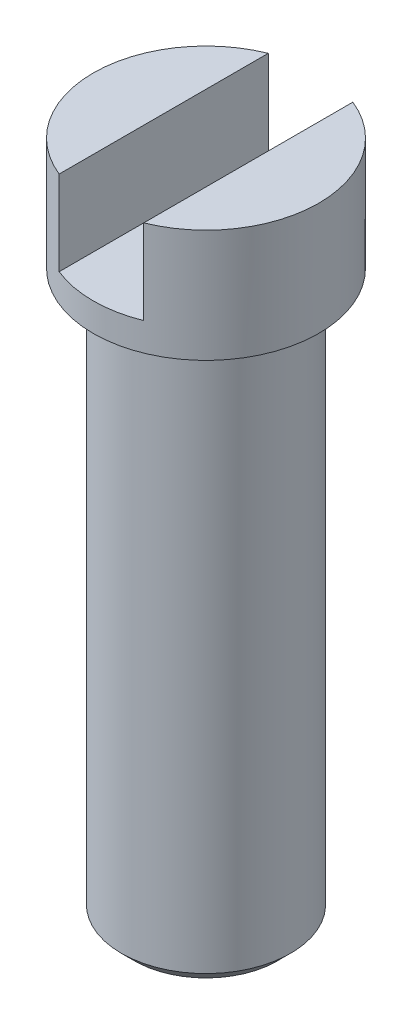
ISO-10303-21;
HEADER;
FILE_DESCRIPTION(('STEP AP214'),'2;1');
FILE_NAME('part.step','',(''),(''),'','','');
FILE_SCHEMA(('AUTOMOTIVE_DESIGN { 1 0 10303 214 1 1 1 1 }'));
ENDSEC;
DATA;
#1=APPLICATION_CONTEXT('core data for automotive mechanical design processes');
#2=APPLICATION_PROTOCOL_DEFINITION('international standard','automotive_design',2000,#1);
#3=PRODUCT_CONTEXT('',#1,'mechanical');
#4=PRODUCT('Part','Part','',(#3));
#5=PRODUCT_RELATED_PRODUCT_CATEGORY('part','',(#4));
#6=PRODUCT_DEFINITION_FORMATION('','',#4);
#7=PRODUCT_DEFINITION_CONTEXT('part definition',#1,'design');
#8=PRODUCT_DEFINITION('design','',#6,#7);
#9=PRODUCT_DEFINITION_SHAPE('','',#8);
#10=(LENGTH_UNIT() NAMED_UNIT(*) SI_UNIT(.MILLI.,.METRE.));
#11=(NAMED_UNIT(*) PLANE_ANGLE_UNIT() SI_UNIT($,.RADIAN.));
#12=(NAMED_UNIT(*) SI_UNIT($,.STERADIAN.) SOLID_ANGLE_UNIT());
#13=UNCERTAINTY_MEASURE_WITH_UNIT(LENGTH_MEASURE(1.E-05),#10,'distance_accuracy_value','');
#14=(GEOMETRIC_REPRESENTATION_CONTEXT(3) GLOBAL_UNCERTAINTY_ASSIGNED_CONTEXT((#13)) GLOBAL_UNIT_ASSIGNED_CONTEXT((#10,
#11,#12)) REPRESENTATION_CONTEXT('',''));
#15=CARTESIAN_POINT('',(0.,0.,0.));
#16=DIRECTION('',(0.,0.,1.));
#17=DIRECTION('',(1.,0.,0.));
#18=AXIS2_PLACEMENT_3D('',#15,#16,#17);
#19=CARTESIAN_POINT('',(0.,5.5,0.));
#20=DIRECTION('',(0.,1.,0.));
#21=DIRECTION('',(1.,0.,0.));
#22=AXIS2_PLACEMENT_3D('',#19,#20,#21);
#23=PLANE('',#22);
#24=DIRECTION('',(0.,0.,-1.));
#25=VECTOR('',#24,1.);
#26=CARTESIAN_POINT('',(0.75,5.5,5.));
#27=LINE('',#26,#25);
#28=CARTESIAN_POINT('',(0.75,5.5,1.85404962177396));
#29=VERTEX_POINT('',#28);
#30=CARTESIAN_POINT('',(0.75,5.5,-1.85404962177396));
#31=VERTEX_POINT('',#30);
#32=EDGE_CURVE('E27',#29,#31,#27,.T.);
#33=ORIENTED_EDGE('',*,*,#32,.T.);
#34=CARTESIAN_POINT('',(0.,5.5,0.));
#35=DIRECTION('',(0.,1.,0.));
#36=DIRECTION('',(0.,0.,-1.));
#37=AXIS2_PLACEMENT_3D('',#34,#35,#36);
#38=CIRCLE('',#37,2.);
#39=CARTESIAN_POINT('',(-0.75,5.5,-1.85404962177396));
#40=VERTEX_POINT('',#39);
#41=EDGE_CURVE('E140',#31,#40,#38,.T.);
#42=ORIENTED_EDGE('',*,*,#41,.T.);
#43=DIRECTION('',(0.,0.,1.));
#44=VECTOR('',#43,1.);
#45=CARTESIAN_POINT('',(-0.75,5.5,-5.));
#46=LINE('',#45,#44);
#47=CARTESIAN_POINT('',(-0.75,5.5,1.85404962177396));
#48=VERTEX_POINT('',#47);
#49=EDGE_CURVE('E11',#40,#48,#46,.T.);
#50=ORIENTED_EDGE('',*,*,#49,.T.);
#51=CARTESIAN_POINT('',(0.,5.5,0.));
#52=DIRECTION('',(0.,1.,0.));
#53=DIRECTION('',(0.,0.,-1.));
#54=AXIS2_PLACEMENT_3D('',#51,#52,#53);
#55=CIRCLE('',#54,2.);
#56=CARTESIAN_POINT('',(0.,5.5,2.));
#57=VERTEX_POINT('',#56);
#58=EDGE_CURVE('E98',#48,#57,#55,.T.);
#59=ORIENTED_EDGE('',*,*,#58,.T.);
#60=CARTESIAN_POINT('',(0.,5.5,0.));
#61=DIRECTION('',(0.,1.,0.));
#62=DIRECTION('',(0.,0.,-1.));
#63=AXIS2_PLACEMENT_3D('',#60,#61,#62);
#64=CIRCLE('',#63,2.);
#65=EDGE_CURVE('E94',#57,#29,#64,.T.);
#66=ORIENTED_EDGE('',*,*,#65,.T.);
#67=EDGE_LOOP('',(#33,#42,#50,#59,#66));
#68=FACE_BOUND('',#67,.T.);
#69=ADVANCED_FACE('F17',(#68),#23,.T.);
#70=CARTESIAN_POINT('',(-0.75,7.,-5.));
#71=DIRECTION('',(-1.,0.,0.));
#72=DIRECTION('',(0.,0.,1.));
#73=AXIS2_PLACEMENT_3D('',#70,#71,#72);
#74=PLANE('',#73);
#75=ORIENTED_EDGE('',*,*,#49,.F.);
#76=DIRECTION('',(0.,-1.,0.));
#77=VECTOR('',#76,1.);
#78=CARTESIAN_POINT('',(-0.75,7.,-1.854049621774));
#79=LINE('',#78,#77);
#80=CARTESIAN_POINT('',(-0.75,7.,-1.85404962177396));
#81=VERTEX_POINT('',#80);
#82=EDGE_CURVE('E133',#81,#40,#79,.T.);
#83=ORIENTED_EDGE('',*,*,#82,.F.);
#84=DIRECTION('',(0.,0.,1.));
#85=VECTOR('',#84,1.);
#86=CARTESIAN_POINT('',(-0.75,7.,0.));
#87=LINE('',#86,#85);
#88=CARTESIAN_POINT('',(-0.75,7.,1.85404962177396));
#89=VERTEX_POINT('',#88);
#90=EDGE_CURVE('E137',#81,#89,#87,.T.);
#91=ORIENTED_EDGE('',*,*,#90,.T.);
#92=DIRECTION('',(0.,1.,0.));
#93=VECTOR('',#92,1.);
#94=CARTESIAN_POINT('',(-0.75,7.,1.854049621774));
#95=LINE('',#94,#93);
#96=EDGE_CURVE('E134',#48,#89,#95,.T.);
#97=ORIENTED_EDGE('',*,*,#96,.F.);
#98=EDGE_LOOP('',(#75,#83,#91,#97));
#99=FACE_BOUND('',#98,.T.);
#100=ADVANCED_FACE('F201',(#99),#74,.F.);
#101=CARTESIAN_POINT('',(0.75,7.,5.));
#102=DIRECTION('',(1.,0.,0.));
#103=DIRECTION('',(0.,1.,0.));
#104=AXIS2_PLACEMENT_3D('',#101,#102,#103);
#105=PLANE('',#104);
#106=ORIENTED_EDGE('',*,*,#32,.F.);
#107=DIRECTION('',(0.,-1.,0.));
#108=VECTOR('',#107,1.);
#109=CARTESIAN_POINT('',(0.75,7.,1.854049621774));
#110=LINE('',#109,#108);
#111=CARTESIAN_POINT('',(0.75,7.,1.85404962177396));
#112=VERTEX_POINT('',#111);
#113=EDGE_CURVE('E118',#112,#29,#110,.T.);
#114=ORIENTED_EDGE('',*,*,#113,.F.);
#115=DIRECTION('',(0.,0.,-1.));
#116=VECTOR('',#115,1.);
#117=CARTESIAN_POINT('',(0.75,7.,0.));
#118=LINE('',#117,#116);
#119=CARTESIAN_POINT('',(0.75,7.,-1.85404962177396));
#120=VERTEX_POINT('',#119);
#121=EDGE_CURVE('E117',#112,#120,#118,.T.);
#122=ORIENTED_EDGE('',*,*,#121,.T.);
#123=DIRECTION('',(0.,1.,0.));
#124=VECTOR('',#123,1.);
#125=CARTESIAN_POINT('',(0.75,7.,-1.854049621774));
#126=LINE('',#125,#124);
#127=EDGE_CURVE('E144',#31,#120,#126,.T.);
#128=ORIENTED_EDGE('',*,*,#127,.F.);
#129=EDGE_LOOP('',(#106,#114,#122,#128));
#130=FACE_BOUND('',#129,.T.);
#131=ADVANCED_FACE('F207',(#130),#105,.F.);
#132=CARTESIAN_POINT('',(0.,7.,0.));
#133=DIRECTION('',(0.,-1.,0.));
#134=DIRECTION('',(0.,0.,-1.));
#135=AXIS2_PLACEMENT_3D('',#132,#133,#134);
#136=PLANE('',#135);
#137=CARTESIAN_POINT('',(0.,7.,0.));
#138=DIRECTION('',(0.,-1.,0.));
#139=DIRECTION('',(0.,0.,-1.));
#140=AXIS2_PLACEMENT_3D('',#137,#138,#139);
#141=CIRCLE('',#140,2.);
#142=EDGE_CURVE('E129',#89,#81,#141,.T.);
#143=ORIENTED_EDGE('',*,*,#142,.F.);
#144=ORIENTED_EDGE('',*,*,#90,.F.);
#145=EDGE_LOOP('',(#143,#144));
#146=FACE_BOUND('',#145,.T.);
#147=ADVANCED_FACE('F19',(#146),#136,.F.);
#148=CARTESIAN_POINT('',(0.,7.,0.));
#149=DIRECTION('',(0.,-1.,0.));
#150=DIRECTION('',(0.,0.,-1.));
#151=AXIS2_PLACEMENT_3D('',#148,#149,#150);
#152=PLANE('',#151);
#153=CARTESIAN_POINT('',(0.,7.,0.));
#154=DIRECTION('',(0.,-1.,0.));
#155=DIRECTION('',(0.,0.,-1.));
#156=AXIS2_PLACEMENT_3D('',#153,#154,#155);
#157=CIRCLE('',#156,2.);
#158=EDGE_CURVE('E121',#120,#112,#157,.T.);
#159=ORIENTED_EDGE('',*,*,#158,.F.);
#160=ORIENTED_EDGE('',*,*,#121,.F.);
#161=EDGE_LOOP('',(#159,#160));
#162=FACE_BOUND('',#161,.T.);
#163=ADVANCED_FACE('F189',(#162),#152,.F.);
#164=CARTESIAN_POINT('',(0.,-5.,0.));
#165=DIRECTION('',(0.,-1.,0.));
#166=DIRECTION('',(0.,0.,-1.));
#167=AXIS2_PLACEMENT_3D('',#164,#165,#166);
#168=PLANE('',#167);
#169=CARTESIAN_POINT('',(0.,-4.99999999999545,0.));
#170=DIRECTION('',(0.,1.,0.));
#171=DIRECTION('',(0.,0.,1.));
#172=AXIS2_PLACEMENT_3D('',#169,#170,#171);
#173=CIRCLE('',#172,1.27000000003363);
#174=CARTESIAN_POINT('',(0.,-4.99999999999545,-1.27000000003363));
#175=VERTEX_POINT('',#174);
#176=EDGE_CURVE('E103',#175,#175,#173,.T.);
#177=ORIENTED_EDGE('',*,*,#176,.F.);
#178=EDGE_LOOP('',(#177));
#179=FACE_BOUND('',#178,.T.);
#180=ADVANCED_FACE('F187',(#179),#168,.T.);
#181=CARTESIAN_POINT('',(0.,5.,0.));
#182=DIRECTION('',(0.,-1.,0.));
#183=DIRECTION('',(0.,0.,-1.));
#184=AXIS2_PLACEMENT_3D('',#181,#182,#183);
#185=PLANE('',#184);
#186=CARTESIAN_POINT('',(0.,5.,0.));
#187=DIRECTION('',(0.,-1.,0.));
#188=DIRECTION('',(0.,0.,-1.));
#189=AXIS2_PLACEMENT_3D('',#186,#187,#188);
#190=CIRCLE('',#189,1.5);
#191=CARTESIAN_POINT('',(0.,5.,1.5));
#192=VERTEX_POINT('',#191);
#193=EDGE_CURVE('E122',#192,#192,#190,.T.);
#194=ORIENTED_EDGE('',*,*,#193,.F.);
#195=EDGE_LOOP('',(#194));
#196=FACE_BOUND('',#195,.T.);
#197=CARTESIAN_POINT('',(0.,5.,0.));
#198=DIRECTION('',(0.,-1.,0.));
#199=DIRECTION('',(0.,0.,-1.));
#200=AXIS2_PLACEMENT_3D('',#197,#198,#199);
#201=CIRCLE('',#200,2.);
#202=CARTESIAN_POINT('',(0.,5.,2.));
#203=VERTEX_POINT('',#202);
#204=EDGE_CURVE('E92',#203,#203,#201,.T.);
#205=ORIENTED_EDGE('',*,*,#204,.T.);
#206=EDGE_LOOP('',(#205));
#207=FACE_BOUND('',#206,.T.);
#208=ADVANCED_FACE('F101',(#196,#207),#185,.T.);
#209=CARTESIAN_POINT('',(0.,7.6,0.));
#210=DIRECTION('',(0.,-1.,0.));
#211=DIRECTION('',(0.,0.,-1.));
#212=AXIS2_PLACEMENT_3D('',#209,#210,#211);
#213=CYLINDRICAL_SURFACE('',#212,2.);
#214=ORIENTED_EDGE('',*,*,#204,.F.);
#215=DIRECTION('',(0.,1.,0.));
#216=VECTOR('',#215,1.);
#217=CARTESIAN_POINT('',(0.,7.6,2.));
#218=LINE('',#217,#216);
#219=EDGE_CURVE('E89',#203,#57,#218,.T.);
#220=ORIENTED_EDGE('',*,*,#219,.T.);
#221=ORIENTED_EDGE('',*,*,#58,.F.);
#222=ORIENTED_EDGE('',*,*,#96,.T.);
#223=ORIENTED_EDGE('',*,*,#142,.T.);
#224=ORIENTED_EDGE('',*,*,#82,.T.);
#225=ORIENTED_EDGE('',*,*,#41,.F.);
#226=ORIENTED_EDGE('',*,*,#127,.T.);
#227=ORIENTED_EDGE('',*,*,#158,.T.);
#228=ORIENTED_EDGE('',*,*,#113,.T.);
#229=ORIENTED_EDGE('',*,*,#65,.F.);
#230=ORIENTED_EDGE('',*,*,#219,.F.);
#231=EDGE_LOOP('',(#214,#220,#221,#222,#223,#224,#225,#226,#227,#228,#229,#230));
#232=FACE_BOUND('',#231,.T.);
#233=ADVANCED_FACE('F91',(#232),#213,.T.);
#234=CARTESIAN_POINT('',(0.,-4.7700000001214,0.));
#235=DIRECTION('',(0.,1.,0.));
#236=DIRECTION('',(0.,0.,1.));
#237=AXIS2_PLACEMENT_3D('',#234,#235,#236);
#238=CONICAL_SURFACE('',#237,1.49999999996453,0.785398163521021);
#239=CARTESIAN_POINT('',(0.,-4.77,0.));
#240=DIRECTION('',(0.,1.,0.));
#241=DIRECTION('',(0.,0.,-1.));
#242=AXIS2_PLACEMENT_3D('',#239,#240,#241);
#243=CIRCLE('',#242,1.5);
#244=CARTESIAN_POINT('',(0.,-4.77,-1.50000000008593));
#245=VERTEX_POINT('',#244);
#246=CARTESIAN_POINT('',(0.,-4.77,1.5));
#247=VERTEX_POINT('',#246);
#248=EDGE_CURVE('E169',#245,#247,#243,.T.);
#249=ORIENTED_EDGE('',*,*,#248,.F.);
#250=DIRECTION('',(0.,-0.707106781099168,0.707106781273927));
#251=VECTOR('',#250,1.);
#252=CARTESIAN_POINT('',(0.,-4.7700000001214,-1.49999999996453));
#253=LINE('',#252,#251);
#254=EDGE_CURVE('E109',#245,#175,#253,.T.);
#255=ORIENTED_EDGE('',*,*,#254,.T.);
#256=ORIENTED_EDGE('',*,*,#176,.T.);
#257=ORIENTED_EDGE('',*,*,#254,.F.);
#258=CARTESIAN_POINT('',(0.,-4.77,0.));
#259=DIRECTION('',(0.,1.,0.));
#260=DIRECTION('',(0.,0.,-1.));
#261=AXIS2_PLACEMENT_3D('',#258,#259,#260);
#262=CIRCLE('',#261,1.5);
#263=EDGE_CURVE('E124',#247,#245,#262,.T.);
#264=ORIENTED_EDGE('',*,*,#263,.F.);
#265=EDGE_LOOP('',(#249,#255,#256,#257,#264));
#266=FACE_BOUND('',#265,.T.);
#267=ADVANCED_FACE('F184',(#266),#238,.T.);
#268=CARTESIAN_POINT('',(0.,7.6,0.));
#269=DIRECTION('',(0.,-1.,0.));
#270=DIRECTION('',(0.,0.,-1.));
#271=AXIS2_PLACEMENT_3D('',#268,#269,#270);
#272=CYLINDRICAL_SURFACE('',#271,1.5);
#273=ORIENTED_EDGE('',*,*,#248,.T.);
#274=DIRECTION('',(0.,1.,0.));
#275=VECTOR('',#274,1.);
#276=CARTESIAN_POINT('',(0.,7.6,1.5));
#277=LINE('',#276,#275);
#278=EDGE_CURVE('E113',#247,#192,#277,.T.);
#279=ORIENTED_EDGE('',*,*,#278,.T.);
#280=ORIENTED_EDGE('',*,*,#193,.T.);
#281=ORIENTED_EDGE('',*,*,#278,.F.);
#282=ORIENTED_EDGE('',*,*,#263,.T.);
#283=EDGE_LOOP('',(#273,#279,#280,#281,#282));
#284=FACE_BOUND('',#283,.T.);
#285=ADVANCED_FACE('F181',(#284),#272,.T.);
#286=CLOSED_SHELL('',(#69,#100,#131,#147,#163,#180,#208,#233,#267,#285));
#287=MANIFOLD_SOLID_BREP('B1',#286);
#288=ADVANCED_BREP_SHAPE_REPRESENTATION('',(#18,#287),#14);
#289=SHAPE_DEFINITION_REPRESENTATION(#9,#288);
ENDSEC;
END-ISO-10303-21;
